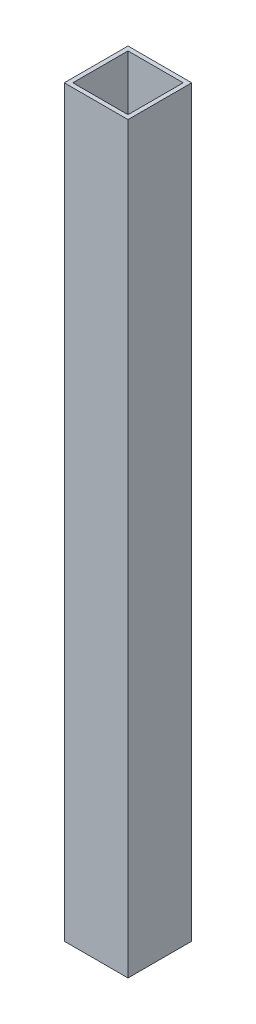
ISO-10303-21;
HEADER;
FILE_DESCRIPTION(('STEP AP214'),'2;1');
FILE_NAME('part.step','',(''),(''),'','','');
FILE_SCHEMA(('AUTOMOTIVE_DESIGN { 1 0 10303 214 1 1 1 1 }'));
ENDSEC;
DATA;
#1=APPLICATION_CONTEXT('core data for automotive mechanical design processes');
#2=APPLICATION_PROTOCOL_DEFINITION('international standard','automotive_design',2000,#1);
#3=PRODUCT_CONTEXT('',#1,'mechanical');
#4=PRODUCT('Part','Part','',(#3));
#5=PRODUCT_RELATED_PRODUCT_CATEGORY('part','',(#4));
#6=PRODUCT_DEFINITION_FORMATION('','',#4);
#7=PRODUCT_DEFINITION_CONTEXT('part definition',#1,'design');
#8=PRODUCT_DEFINITION('design','',#6,#7);
#9=PRODUCT_DEFINITION_SHAPE('','',#8);
#10=(LENGTH_UNIT() NAMED_UNIT(*) SI_UNIT(.MILLI.,.METRE.));
#11=(NAMED_UNIT(*) PLANE_ANGLE_UNIT() SI_UNIT($,.RADIAN.));
#12=(NAMED_UNIT(*) SI_UNIT($,.STERADIAN.) SOLID_ANGLE_UNIT());
#13=UNCERTAINTY_MEASURE_WITH_UNIT(LENGTH_MEASURE(1.E-05),#10,'distance_accuracy_value','');
#14=(GEOMETRIC_REPRESENTATION_CONTEXT(3) GLOBAL_UNCERTAINTY_ASSIGNED_CONTEXT((#13)) GLOBAL_UNIT_ASSIGNED_CONTEXT((#10,
#11,#12)) REPRESENTATION_CONTEXT('',''));
#15=CARTESIAN_POINT('',(0.,0.,0.));
#16=DIRECTION('',(0.,0.,1.));
#17=DIRECTION('',(1.,0.,0.));
#18=AXIS2_PLACEMENT_3D('',#15,#16,#17);
#19=CARTESIAN_POINT('',(0.,175.,0.));
#20=DIRECTION('',(0.,-1.,0.));
#21=DIRECTION('',(0.,0.,-1.));
#22=AXIS2_PLACEMENT_3D('',#19,#20,#21);
#23=PLANE('',#22);
#24=DIRECTION('',(0.,0.,-1.));
#25=VECTOR('',#24,1.);
#26=CARTESIAN_POINT('',(7.5,175.,7.5));
#27=LINE('',#26,#25);
#28=CARTESIAN_POINT('',(7.5,175.,7.5));
#29=VERTEX_POINT('',#28);
#30=CARTESIAN_POINT('',(7.5,175.,-7.50000000000001));
#31=VERTEX_POINT('',#30);
#32=EDGE_CURVE('E142',#29,#31,#27,.T.);
#33=ORIENTED_EDGE('',*,*,#32,.T.);
#34=DIRECTION('',(-1.,0.,0.));
#35=VECTOR('',#34,1.);
#36=CARTESIAN_POINT('',(-7.5,175.,-7.50000000000001));
#37=LINE('',#36,#35);
#38=CARTESIAN_POINT('',(-7.5,175.,-7.50000000000001));
#39=VERTEX_POINT('',#38);
#40=EDGE_CURVE('E145',#31,#39,#37,.T.);
#41=ORIENTED_EDGE('',*,*,#40,.T.);
#42=DIRECTION('',(0.,0.,1.));
#43=VECTOR('',#42,1.);
#44=CARTESIAN_POINT('',(-7.5,175.,7.5));
#45=LINE('',#44,#43);
#46=CARTESIAN_POINT('',(-7.5,175.,7.5));
#47=VERTEX_POINT('',#46);
#48=EDGE_CURVE('E148',#39,#47,#45,.T.);
#49=ORIENTED_EDGE('',*,*,#48,.T.);
#50=DIRECTION('',(1.,0.,0.));
#51=VECTOR('',#50,1.);
#52=CARTESIAN_POINT('',(-7.5,175.,7.5));
#53=LINE('',#52,#51);
#54=EDGE_CURVE('E150',#47,#29,#53,.T.);
#55=ORIENTED_EDGE('',*,*,#54,.T.);
#56=EDGE_LOOP('',(#33,#41,#49,#55));
#57=FACE_BOUND('',#56,.T.);
#58=DIRECTION('',(0.,0.,-1.));
#59=VECTOR('',#58,1.);
#60=CARTESIAN_POINT('',(6.5,175.,6.5));
#61=LINE('',#60,#59);
#62=CARTESIAN_POINT('',(6.5,175.,6.5));
#63=VERTEX_POINT('',#62);
#64=CARTESIAN_POINT('',(6.5,175.,-6.5));
#65=VERTEX_POINT('',#64);
#66=EDGE_CURVE('E106',#63,#65,#61,.T.);
#67=ORIENTED_EDGE('',*,*,#66,.F.);
#68=DIRECTION('',(1.,0.,0.));
#69=VECTOR('',#68,1.);
#70=CARTESIAN_POINT('',(-6.5,175.,6.5));
#71=LINE('',#70,#69);
#72=CARTESIAN_POINT('',(-6.5,175.,6.5));
#73=VERTEX_POINT('',#72);
#74=EDGE_CURVE('E128',#73,#63,#71,.T.);
#75=ORIENTED_EDGE('',*,*,#74,.F.);
#76=DIRECTION('',(0.,0.,1.));
#77=VECTOR('',#76,1.);
#78=CARTESIAN_POINT('',(-6.5,175.,6.5));
#79=LINE('',#78,#77);
#80=CARTESIAN_POINT('',(-6.5,175.,-6.5));
#81=VERTEX_POINT('',#80);
#82=EDGE_CURVE('E126',#81,#73,#79,.T.);
#83=ORIENTED_EDGE('',*,*,#82,.F.);
#84=DIRECTION('',(-1.,0.,0.));
#85=VECTOR('',#84,1.);
#86=CARTESIAN_POINT('',(-6.5,175.,-6.5));
#87=LINE('',#86,#85);
#88=EDGE_CURVE('E114',#65,#81,#87,.T.);
#89=ORIENTED_EDGE('',*,*,#88,.F.);
#90=EDGE_LOOP('',(#67,#75,#83,#89));
#91=FACE_BOUND('',#90,.T.);
#92=ADVANCED_FACE('F41',(#57,#91),#23,.F.);
#93=CARTESIAN_POINT('',(0.,0.,0.));
#94=DIRECTION('',(0.,-1.,0.));
#95=DIRECTION('',(0.,0.,-1.));
#96=AXIS2_PLACEMENT_3D('',#93,#94,#95);
#97=PLANE('',#96);
#98=DIRECTION('',(0.,0.,-1.));
#99=VECTOR('',#98,1.);
#100=CARTESIAN_POINT('',(7.5,0.,7.5));
#101=LINE('',#100,#99);
#102=CARTESIAN_POINT('',(7.5,0.,7.5));
#103=VERTEX_POINT('',#102);
#104=CARTESIAN_POINT('',(7.5,0.,-7.50000000000001));
#105=VERTEX_POINT('',#104);
#106=EDGE_CURVE('E122',#103,#105,#101,.T.);
#107=ORIENTED_EDGE('',*,*,#106,.F.);
#108=DIRECTION('',(1.,0.,0.));
#109=VECTOR('',#108,1.);
#110=CARTESIAN_POINT('',(-7.5,0.,7.5));
#111=LINE('',#110,#109);
#112=CARTESIAN_POINT('',(-7.5,0.,7.5));
#113=VERTEX_POINT('',#112);
#114=EDGE_CURVE('E146',#113,#103,#111,.T.);
#115=ORIENTED_EDGE('',*,*,#114,.F.);
#116=DIRECTION('',(0.,0.,1.));
#117=VECTOR('',#116,1.);
#118=CARTESIAN_POINT('',(-7.5,0.,7.5));
#119=LINE('',#118,#117);
#120=CARTESIAN_POINT('',(-7.5,0.,-7.50000000000001));
#121=VERTEX_POINT('',#120);
#122=EDGE_CURVE('E157',#121,#113,#119,.T.);
#123=ORIENTED_EDGE('',*,*,#122,.F.);
#124=DIRECTION('',(-1.,0.,0.));
#125=VECTOR('',#124,1.);
#126=CARTESIAN_POINT('',(-7.5,0.,-7.50000000000001));
#127=LINE('',#126,#125);
#128=EDGE_CURVE('E155',#105,#121,#127,.T.);
#129=ORIENTED_EDGE('',*,*,#128,.F.);
#130=EDGE_LOOP('',(#107,#115,#123,#129));
#131=FACE_BOUND('',#130,.T.);
#132=DIRECTION('',(1.,0.,0.));
#133=VECTOR('',#132,1.);
#134=CARTESIAN_POINT('',(-6.5,0.,6.5));
#135=LINE('',#134,#133);
#136=CARTESIAN_POINT('',(-6.5,0.,6.5));
#137=VERTEX_POINT('',#136);
#138=CARTESIAN_POINT('',(6.5,0.,6.5));
#139=VERTEX_POINT('',#138);
#140=EDGE_CURVE('E115',#137,#139,#135,.T.);
#141=ORIENTED_EDGE('',*,*,#140,.T.);
#142=DIRECTION('',(0.,0.,-1.));
#143=VECTOR('',#142,1.);
#144=CARTESIAN_POINT('',(6.5,0.,6.5));
#145=LINE('',#144,#143);
#146=CARTESIAN_POINT('',(6.5,0.,-6.5));
#147=VERTEX_POINT('',#146);
#148=EDGE_CURVE('E64',#139,#147,#145,.T.);
#149=ORIENTED_EDGE('',*,*,#148,.T.);
#150=DIRECTION('',(-1.,0.,0.));
#151=VECTOR('',#150,1.);
#152=CARTESIAN_POINT('',(-6.5,0.,-6.5));
#153=LINE('',#152,#151);
#154=CARTESIAN_POINT('',(-6.5,0.,-6.5));
#155=VERTEX_POINT('',#154);
#156=EDGE_CURVE('E121',#147,#155,#153,.T.);
#157=ORIENTED_EDGE('',*,*,#156,.T.);
#158=DIRECTION('',(0.,0.,1.));
#159=VECTOR('',#158,1.);
#160=CARTESIAN_POINT('',(-6.5,0.,6.5));
#161=LINE('',#160,#159);
#162=EDGE_CURVE('E134',#155,#137,#161,.T.);
#163=ORIENTED_EDGE('',*,*,#162,.T.);
#164=EDGE_LOOP('',(#141,#149,#157,#163));
#165=FACE_BOUND('',#164,.T.);
#166=ADVANCED_FACE('F175',(#131,#165),#97,.T.);
#167=CARTESIAN_POINT('',(7.5,175.,7.5));
#168=DIRECTION('',(-1.,0.,0.));
#169=DIRECTION('',(0.,0.,1.));
#170=AXIS2_PLACEMENT_3D('',#167,#168,#169);
#171=PLANE('',#170);
#172=ORIENTED_EDGE('',*,*,#106,.T.);
#173=DIRECTION('',(0.,-1.,0.));
#174=VECTOR('',#173,1.);
#175=CARTESIAN_POINT('',(7.5,175.,-7.50000000000001));
#176=LINE('',#175,#174);
#177=EDGE_CURVE('E11',#31,#105,#176,.T.);
#178=ORIENTED_EDGE('',*,*,#177,.F.);
#179=ORIENTED_EDGE('',*,*,#32,.F.);
#180=DIRECTION('',(0.,-1.,0.));
#181=VECTOR('',#180,1.);
#182=CARTESIAN_POINT('',(7.5,175.,7.5));
#183=LINE('',#182,#181);
#184=EDGE_CURVE('E152',#29,#103,#183,.T.);
#185=ORIENTED_EDGE('',*,*,#184,.T.);
#186=EDGE_LOOP('',(#172,#178,#179,#185));
#187=FACE_BOUND('',#186,.T.);
#188=ADVANCED_FACE('F43',(#187),#171,.F.);
#189=CARTESIAN_POINT('',(-7.5,175.,-7.50000000000001));
#190=DIRECTION('',(0.,0.,1.));
#191=DIRECTION('',(1.,0.,0.));
#192=AXIS2_PLACEMENT_3D('',#189,#190,#191);
#193=PLANE('',#192);
#194=ORIENTED_EDGE('',*,*,#128,.T.);
#195=DIRECTION('',(0.,-1.,0.));
#196=VECTOR('',#195,1.);
#197=CARTESIAN_POINT('',(-7.5,175.,-7.50000000000001));
#198=LINE('',#197,#196);
#199=EDGE_CURVE('E49',#39,#121,#198,.T.);
#200=ORIENTED_EDGE('',*,*,#199,.F.);
#201=ORIENTED_EDGE('',*,*,#40,.F.);
#202=ORIENTED_EDGE('',*,*,#177,.T.);
#203=EDGE_LOOP('',(#194,#200,#201,#202));
#204=FACE_BOUND('',#203,.T.);
#205=ADVANCED_FACE('F185',(#204),#193,.F.);
#206=CARTESIAN_POINT('',(-7.5,175.,7.5));
#207=DIRECTION('',(1.,0.,0.));
#208=DIRECTION('',(0.,0.,-1.));
#209=AXIS2_PLACEMENT_3D('',#206,#207,#208);
#210=PLANE('',#209);
#211=ORIENTED_EDGE('',*,*,#122,.T.);
#212=DIRECTION('',(0.,-1.,0.));
#213=VECTOR('',#212,1.);
#214=CARTESIAN_POINT('',(-7.5,175.,7.5));
#215=LINE('',#214,#213);
#216=EDGE_CURVE('E162',#47,#113,#215,.T.);
#217=ORIENTED_EDGE('',*,*,#216,.F.);
#218=ORIENTED_EDGE('',*,*,#48,.F.);
#219=ORIENTED_EDGE('',*,*,#199,.T.);
#220=EDGE_LOOP('',(#211,#217,#218,#219));
#221=FACE_BOUND('',#220,.T.);
#222=ADVANCED_FACE('F169',(#221),#210,.F.);
#223=CARTESIAN_POINT('',(-7.5,175.,7.5));
#224=DIRECTION('',(0.,0.,-1.));
#225=DIRECTION('',(-1.,0.,0.));
#226=AXIS2_PLACEMENT_3D('',#223,#224,#225);
#227=PLANE('',#226);
#228=ORIENTED_EDGE('',*,*,#114,.T.);
#229=ORIENTED_EDGE('',*,*,#184,.F.);
#230=ORIENTED_EDGE('',*,*,#54,.F.);
#231=ORIENTED_EDGE('',*,*,#216,.T.);
#232=EDGE_LOOP('',(#228,#229,#230,#231));
#233=FACE_BOUND('',#232,.T.);
#234=ADVANCED_FACE('F179',(#233),#227,.F.);
#235=CARTESIAN_POINT('',(6.5,175.,6.5));
#236=DIRECTION('',(-1.,0.,0.));
#237=DIRECTION('',(0.,0.,1.));
#238=AXIS2_PLACEMENT_3D('',#235,#236,#237);
#239=PLANE('',#238);
#240=ORIENTED_EDGE('',*,*,#148,.F.);
#241=DIRECTION('',(0.,-1.,0.));
#242=VECTOR('',#241,1.);
#243=CARTESIAN_POINT('',(6.5,175.,6.5));
#244=LINE('',#243,#242);
#245=EDGE_CURVE('E110',#63,#139,#244,.T.);
#246=ORIENTED_EDGE('',*,*,#245,.F.);
#247=ORIENTED_EDGE('',*,*,#66,.T.);
#248=DIRECTION('',(0.,-1.,0.));
#249=VECTOR('',#248,1.);
#250=CARTESIAN_POINT('',(6.5,175.,-6.5));
#251=LINE('',#250,#249);
#252=EDGE_CURVE('E109',#65,#147,#251,.T.);
#253=ORIENTED_EDGE('',*,*,#252,.T.);
#254=EDGE_LOOP('',(#240,#246,#247,#253));
#255=FACE_BOUND('',#254,.T.);
#256=ADVANCED_FACE('F108',(#255),#239,.T.);
#257=CARTESIAN_POINT('',(-6.5,175.,-6.5));
#258=DIRECTION('',(0.,0.,1.));
#259=DIRECTION('',(1.,0.,0.));
#260=AXIS2_PLACEMENT_3D('',#257,#258,#259);
#261=PLANE('',#260);
#262=ORIENTED_EDGE('',*,*,#156,.F.);
#263=ORIENTED_EDGE('',*,*,#252,.F.);
#264=ORIENTED_EDGE('',*,*,#88,.T.);
#265=DIRECTION('',(0.,-1.,0.));
#266=VECTOR('',#265,1.);
#267=CARTESIAN_POINT('',(-6.5,175.,-6.5));
#268=LINE('',#267,#266);
#269=EDGE_CURVE('E123',#81,#155,#268,.T.);
#270=ORIENTED_EDGE('',*,*,#269,.T.);
#271=EDGE_LOOP('',(#262,#263,#264,#270));
#272=FACE_BOUND('',#271,.T.);
#273=ADVANCED_FACE('F118',(#272),#261,.T.);
#274=CARTESIAN_POINT('',(-6.5,175.,6.5));
#275=DIRECTION('',(1.,0.,0.));
#276=DIRECTION('',(0.,0.,-1.));
#277=AXIS2_PLACEMENT_3D('',#274,#275,#276);
#278=PLANE('',#277);
#279=ORIENTED_EDGE('',*,*,#162,.F.);
#280=ORIENTED_EDGE('',*,*,#269,.F.);
#281=ORIENTED_EDGE('',*,*,#82,.T.);
#282=DIRECTION('',(0.,-1.,0.));
#283=VECTOR('',#282,1.);
#284=CARTESIAN_POINT('',(-6.5,175.,6.5));
#285=LINE('',#284,#283);
#286=EDGE_CURVE('E56',#73,#137,#285,.T.);
#287=ORIENTED_EDGE('',*,*,#286,.T.);
#288=EDGE_LOOP('',(#279,#280,#281,#287));
#289=FACE_BOUND('',#288,.T.);
#290=ADVANCED_FACE('F208',(#289),#278,.T.);
#291=CARTESIAN_POINT('',(-6.5,175.,6.5));
#292=DIRECTION('',(0.,0.,-1.));
#293=DIRECTION('',(-1.,0.,0.));
#294=AXIS2_PLACEMENT_3D('',#291,#292,#293);
#295=PLANE('',#294);
#296=ORIENTED_EDGE('',*,*,#140,.F.);
#297=ORIENTED_EDGE('',*,*,#286,.F.);
#298=ORIENTED_EDGE('',*,*,#74,.T.);
#299=ORIENTED_EDGE('',*,*,#245,.T.);
#300=EDGE_LOOP('',(#296,#297,#298,#299));
#301=FACE_BOUND('',#300,.T.);
#302=ADVANCED_FACE('F212',(#301),#295,.T.);
#303=CLOSED_SHELL('',(#92,#166,#188,#205,#222,#234,#256,#273,#290,#302));
#304=MANIFOLD_SOLID_BREP('B2',#303);
#305=ADVANCED_BREP_SHAPE_REPRESENTATION('',(#18,#304),#14);
#306=SHAPE_DEFINITION_REPRESENTATION(#9,#305);
ENDSEC;
END-ISO-10303-21;
